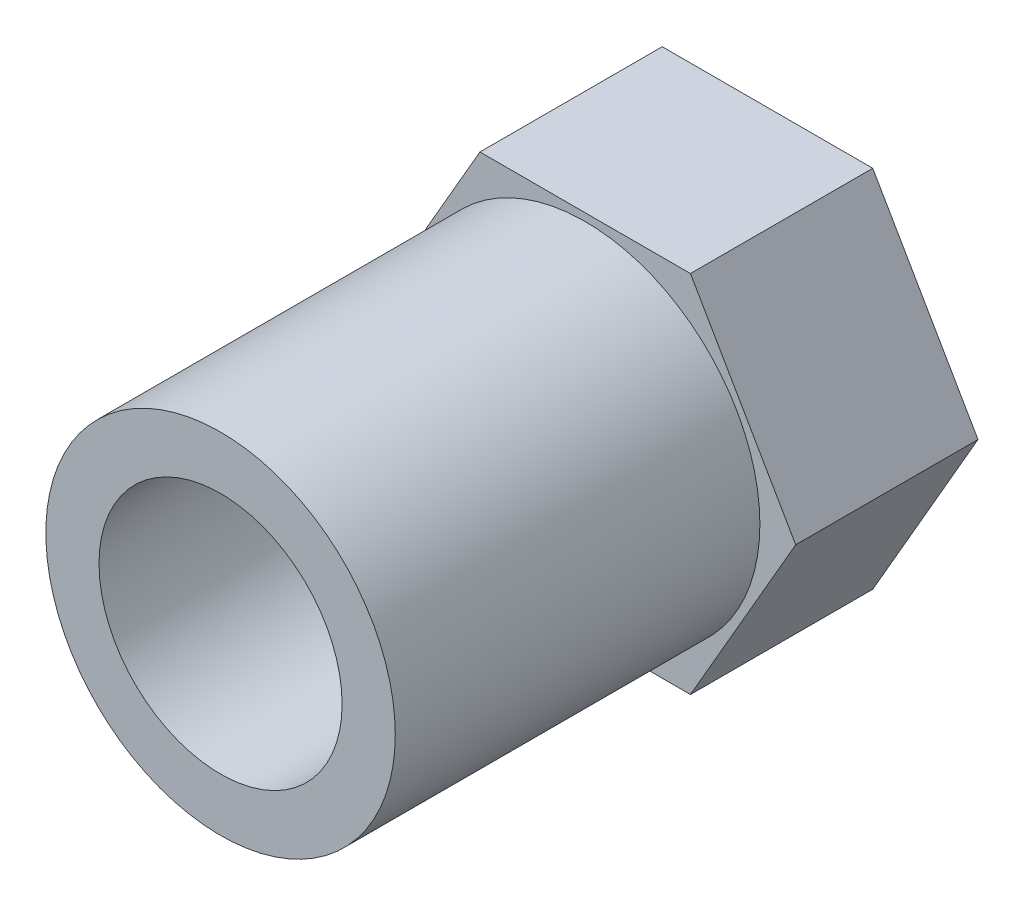
ISO-10303-21;
HEADER;
FILE_DESCRIPTION(('STEP AP214'),'2;1');
FILE_NAME('part.step','',(''),(''),'','','');
FILE_SCHEMA(('AUTOMOTIVE_DESIGN { 1 0 10303 214 1 1 1 1 }'));
ENDSEC;
DATA;
#1=APPLICATION_CONTEXT('core data for automotive mechanical design processes');
#2=APPLICATION_PROTOCOL_DEFINITION('international standard','automotive_design',2000,#1);
#3=PRODUCT_CONTEXT('',#1,'mechanical');
#4=PRODUCT('Part','Part','',(#3));
#5=PRODUCT_RELATED_PRODUCT_CATEGORY('part','',(#4));
#6=PRODUCT_DEFINITION_FORMATION('','',#4);
#7=PRODUCT_DEFINITION_CONTEXT('part definition',#1,'design');
#8=PRODUCT_DEFINITION('design','',#6,#7);
#9=PRODUCT_DEFINITION_SHAPE('','',#8);
#10=(LENGTH_UNIT() NAMED_UNIT(*) SI_UNIT(.MILLI.,.METRE.));
#11=(NAMED_UNIT(*) PLANE_ANGLE_UNIT() SI_UNIT($,.RADIAN.));
#12=(NAMED_UNIT(*) SI_UNIT($,.STERADIAN.) SOLID_ANGLE_UNIT());
#13=UNCERTAINTY_MEASURE_WITH_UNIT(LENGTH_MEASURE(1.E-05),#10,'distance_accuracy_value','');
#14=(GEOMETRIC_REPRESENTATION_CONTEXT(3) GLOBAL_UNCERTAINTY_ASSIGNED_CONTEXT((#13)) GLOBAL_UNIT_ASSIGNED_CONTEXT((#10,
#11,#12)) REPRESENTATION_CONTEXT('',''));
#15=CARTESIAN_POINT('',(0.,0.,0.));
#16=DIRECTION('',(0.,0.,1.));
#17=DIRECTION('',(1.,0.,0.));
#18=AXIS2_PLACEMENT_3D('',#15,#16,#17);
#19=CARTESIAN_POINT('',(0.,0.,12.));
#20=DIRECTION('',(0.,0.,1.));
#21=DIRECTION('',(1.,0.,0.));
#22=AXIS2_PLACEMENT_3D('',#19,#20,#21);
#23=PLANE('',#22);
#24=CARTESIAN_POINT('',(0.,0.,12.));
#25=DIRECTION('',(0.,0.,1.));
#26=DIRECTION('',(1.,0.,0.));
#27=AXIS2_PLACEMENT_3D('',#24,#25,#26);
#28=CIRCLE('',#27,5.75);
#29=CARTESIAN_POINT('',(5.75,0.,12.));
#30=VERTEX_POINT('',#29);
#31=EDGE_CURVE('E11',#30,#30,#28,.T.);
#32=ORIENTED_EDGE('',*,*,#31,.T.);
#33=EDGE_LOOP('',(#32));
#34=FACE_BOUND('',#33,.T.);
#35=CARTESIAN_POINT('',(0.,0.,12.));
#36=DIRECTION('',(0.,0.,1.));
#37=DIRECTION('',(1.,0.,0.));
#38=AXIS2_PLACEMENT_3D('',#35,#36,#37);
#39=CIRCLE('',#38,4.);
#40=CARTESIAN_POINT('',(4.,0.,12.));
#41=VERTEX_POINT('',#40);
#42=EDGE_CURVE('E54',#41,#41,#39,.T.);
#43=ORIENTED_EDGE('',*,*,#42,.F.);
#44=EDGE_LOOP('',(#43));
#45=FACE_BOUND('',#44,.T.);
#46=ADVANCED_FACE('F43',(#34,#45),#23,.T.);
#47=CARTESIAN_POINT('',(0.,0.,12.));
#48=DIRECTION('',(0.,0.,-1.));
#49=DIRECTION('',(-1.,0.,0.));
#50=AXIS2_PLACEMENT_3D('',#47,#48,#49);
#51=CYLINDRICAL_SURFACE('',#50,5.75);
#52=ORIENTED_EDGE('',*,*,#31,.F.);
#53=EDGE_LOOP('',(#52));
#54=FACE_BOUND('',#53,.T.);
#55=CARTESIAN_POINT('',(0.,0.,0.));
#56=DIRECTION('',(0.,0.,1.));
#57=DIRECTION('',(1.,0.,0.));
#58=AXIS2_PLACEMENT_3D('',#55,#56,#57);
#59=CIRCLE('',#58,5.75);
#60=CARTESIAN_POINT('',(5.75,0.,0.));
#61=VERTEX_POINT('',#60);
#62=EDGE_CURVE('E47',#61,#61,#59,.T.);
#63=ORIENTED_EDGE('',*,*,#62,.T.);
#64=EDGE_LOOP('',(#63));
#65=FACE_BOUND('',#64,.T.);
#66=ADVANCED_FACE('F45',(#54,#65),#51,.T.);
#67=CARTESIAN_POINT('',(0.,0.,12.));
#68=DIRECTION('',(0.,0.,-1.));
#69=DIRECTION('',(-1.,0.,0.));
#70=AXIS2_PLACEMENT_3D('',#67,#68,#69);
#71=CYLINDRICAL_SURFACE('',#70,4.);
#72=ORIENTED_EDGE('',*,*,#42,.T.);
#73=EDGE_LOOP('',(#72));
#74=FACE_BOUND('',#73,.T.);
#75=CARTESIAN_POINT('',(0.,0.,0.));
#76=DIRECTION('',(0.,0.,1.));
#77=DIRECTION('',(1.,0.,0.));
#78=AXIS2_PLACEMENT_3D('',#75,#76,#77);
#79=CIRCLE('',#78,4.);
#80=CARTESIAN_POINT('',(4.,0.,0.));
#81=VERTEX_POINT('',#80);
#82=EDGE_CURVE('E170',#81,#81,#79,.T.);
#83=ORIENTED_EDGE('',*,*,#82,.F.);
#84=EDGE_LOOP('',(#83));
#85=FACE_BOUND('',#84,.T.);
#86=ADVANCED_FACE('F209',(#74,#85),#71,.F.);
#87=CARTESIAN_POINT('',(0.,0.,0.));
#88=DIRECTION('',(0.,0.,1.));
#89=DIRECTION('',(1.,0.,0.));
#90=AXIS2_PLACEMENT_3D('',#87,#88,#89);
#91=PLANE('',#90);
#92=CARTESIAN_POINT('',(0.,0.,0.));
#93=DIRECTION('',(0.,0.,1.));
#94=DIRECTION('',(1.,0.,0.));
#95=AXIS2_PLACEMENT_3D('',#92,#93,#94);
#96=CIRCLE('',#95,1.65);
#97=CARTESIAN_POINT('',(1.65,0.,0.));
#98=VERTEX_POINT('',#97);
#99=EDGE_CURVE('E139',#98,#98,#96,.T.);
#100=ORIENTED_EDGE('',*,*,#99,.F.);
#101=EDGE_LOOP('',(#100));
#102=FACE_BOUND('',#101,.T.);
#103=ORIENTED_EDGE('',*,*,#82,.T.);
#104=EDGE_LOOP('',(#103));
#105=FACE_BOUND('',#104,.T.);
#106=ADVANCED_FACE('F184',(#102,#105),#91,.T.);
#107=CARTESIAN_POINT('',(-5.19615242270663,3.,-6.));
#108=DIRECTION('',(0.866025403784439,-0.5,0.));
#109=DIRECTION('',(0.5,0.866025403784439,0.));
#110=AXIS2_PLACEMENT_3D('',#107,#108,#109);
#111=PLANE('',#110);
#112=DIRECTION('',(0.5,0.866025403784439,0.));
#113=VECTOR('',#112,1.);
#114=CARTESIAN_POINT('',(-5.19615242270663,3.,0.));
#115=LINE('',#114,#113);
#116=CARTESIAN_POINT('',(-6.92820323027551,0.,0.));
#117=VERTEX_POINT('',#116);
#118=CARTESIAN_POINT('',(-3.46410161513775,6.,0.));
#119=VERTEX_POINT('',#118);
#120=EDGE_CURVE('E134',#117,#119,#115,.T.);
#121=ORIENTED_EDGE('',*,*,#120,.T.);
#122=DIRECTION('',(0.,0.,1.));
#123=VECTOR('',#122,1.);
#124=CARTESIAN_POINT('',(-3.46410161513775,6.,-6.));
#125=LINE('',#124,#123);
#126=CARTESIAN_POINT('',(-3.46410161513775,6.,-6.));
#127=VERTEX_POINT('',#126);
#128=EDGE_CURVE('E153',#127,#119,#125,.T.);
#129=ORIENTED_EDGE('',*,*,#128,.F.);
#130=DIRECTION('',(0.5,0.866025403784439,0.));
#131=VECTOR('',#130,1.);
#132=CARTESIAN_POINT('',(-5.19615242270663,3.,-6.));
#133=LINE('',#132,#131);
#134=CARTESIAN_POINT('',(-6.92820323027551,0.,-6.));
#135=VERTEX_POINT('',#134);
#136=EDGE_CURVE('E152',#135,#127,#133,.T.);
#137=ORIENTED_EDGE('',*,*,#136,.F.);
#138=DIRECTION('',(0.,0.,1.));
#139=VECTOR('',#138,1.);
#140=CARTESIAN_POINT('',(-6.92820323027551,0.,-6.));
#141=LINE('',#140,#139);
#142=EDGE_CURVE('E133',#135,#117,#141,.T.);
#143=ORIENTED_EDGE('',*,*,#142,.T.);
#144=EDGE_LOOP('',(#121,#129,#137,#143));
#145=FACE_BOUND('',#144,.T.);
#146=ADVANCED_FACE('F189',(#145),#111,.F.);
#147=CARTESIAN_POINT('',(0.,6.,-6.));
#148=DIRECTION('',(0.,-1.,0.));
#149=DIRECTION('',(0.,0.,-1.));
#150=AXIS2_PLACEMENT_3D('',#147,#148,#149);
#151=PLANE('',#150);
#152=DIRECTION('',(1.,0.,0.));
#153=VECTOR('',#152,1.);
#154=CARTESIAN_POINT('',(0.,6.,0.));
#155=LINE('',#154,#153);
#156=CARTESIAN_POINT('',(3.46410161513775,6.,0.));
#157=VERTEX_POINT('',#156);
#158=EDGE_CURVE('E82',#119,#157,#155,.T.);
#159=ORIENTED_EDGE('',*,*,#158,.T.);
#160=DIRECTION('',(0.,0.,1.));
#161=VECTOR('',#160,1.);
#162=CARTESIAN_POINT('',(3.46410161513775,6.,-6.));
#163=LINE('',#162,#161);
#164=CARTESIAN_POINT('',(3.46410161513775,6.,-6.));
#165=VERTEX_POINT('',#164);
#166=EDGE_CURVE('E118',#165,#157,#163,.T.);
#167=ORIENTED_EDGE('',*,*,#166,.F.);
#168=DIRECTION('',(1.,0.,0.));
#169=VECTOR('',#168,1.);
#170=CARTESIAN_POINT('',(0.,6.,-6.));
#171=LINE('',#170,#169);
#172=EDGE_CURVE('E62',#127,#165,#171,.T.);
#173=ORIENTED_EDGE('',*,*,#172,.F.);
#174=ORIENTED_EDGE('',*,*,#128,.T.);
#175=EDGE_LOOP('',(#159,#167,#173,#174));
#176=FACE_BOUND('',#175,.T.);
#177=ADVANCED_FACE('F217',(#176),#151,.F.);
#178=CARTESIAN_POINT('',(5.19615242270663,3.,-6.));
#179=DIRECTION('',(-0.866025403784439,-0.5,0.));
#180=DIRECTION('',(0.5,-0.866025403784439,0.));
#181=AXIS2_PLACEMENT_3D('',#178,#179,#180);
#182=PLANE('',#181);
#183=DIRECTION('',(0.5,-0.866025403784439,0.));
#184=VECTOR('',#183,1.);
#185=CARTESIAN_POINT('',(5.19615242270663,3.,0.));
#186=LINE('',#185,#184);
#187=CARTESIAN_POINT('',(6.92820323027551,0.,0.));
#188=VERTEX_POINT('',#187);
#189=EDGE_CURVE('E114',#157,#188,#186,.T.);
#190=ORIENTED_EDGE('',*,*,#189,.T.);
#191=DIRECTION('',(0.,0.,1.));
#192=VECTOR('',#191,1.);
#193=CARTESIAN_POINT('',(6.92820323027551,0.,-6.));
#194=LINE('',#193,#192);
#195=CARTESIAN_POINT('',(6.92820323027551,0.,-6.));
#196=VERTEX_POINT('',#195);
#197=EDGE_CURVE('E112',#196,#188,#194,.T.);
#198=ORIENTED_EDGE('',*,*,#197,.F.);
#199=DIRECTION('',(0.5,-0.866025403784439,0.));
#200=VECTOR('',#199,1.);
#201=CARTESIAN_POINT('',(5.19615242270663,3.,-6.));
#202=LINE('',#201,#200);
#203=EDGE_CURVE('E102',#165,#196,#202,.T.);
#204=ORIENTED_EDGE('',*,*,#203,.F.);
#205=ORIENTED_EDGE('',*,*,#166,.T.);
#206=EDGE_LOOP('',(#190,#198,#204,#205));
#207=FACE_BOUND('',#206,.T.);
#208=ADVANCED_FACE('F113',(#207),#182,.F.);
#209=CARTESIAN_POINT('',(5.19615242270663,-3.,-6.));
#210=DIRECTION('',(-0.866025403784439,0.5,0.));
#211=DIRECTION('',(-0.5,-0.866025403784439,0.));
#212=AXIS2_PLACEMENT_3D('',#209,#210,#211);
#213=PLANE('',#212);
#214=DIRECTION('',(-0.5,-0.866025403784439,0.));
#215=VECTOR('',#214,1.);
#216=CARTESIAN_POINT('',(5.19615242270663,-3.,0.));
#217=LINE('',#216,#215);
#218=CARTESIAN_POINT('',(3.46410161513775,-6.,0.));
#219=VERTEX_POINT('',#218);
#220=EDGE_CURVE('E145',#188,#219,#217,.T.);
#221=ORIENTED_EDGE('',*,*,#220,.T.);
#222=DIRECTION('',(0.,0.,1.));
#223=VECTOR('',#222,1.);
#224=CARTESIAN_POINT('',(3.46410161513775,-6.,-6.));
#225=LINE('',#224,#223);
#226=CARTESIAN_POINT('',(3.46410161513775,-6.,-6.));
#227=VERTEX_POINT('',#226);
#228=EDGE_CURVE('E119',#227,#219,#225,.T.);
#229=ORIENTED_EDGE('',*,*,#228,.F.);
#230=DIRECTION('',(-0.5,-0.866025403784439,0.));
#231=VECTOR('',#230,1.);
#232=CARTESIAN_POINT('',(5.19615242270663,-3.,-6.));
#233=LINE('',#232,#231);
#234=EDGE_CURVE('E106',#196,#227,#233,.T.);
#235=ORIENTED_EDGE('',*,*,#234,.F.);
#236=ORIENTED_EDGE('',*,*,#197,.T.);
#237=EDGE_LOOP('',(#221,#229,#235,#236));
#238=FACE_BOUND('',#237,.T.);
#239=ADVANCED_FACE('F121',(#238),#213,.F.);
#240=CARTESIAN_POINT('',(0.,-6.,-6.));
#241=DIRECTION('',(0.,1.,0.));
#242=DIRECTION('',(0.,0.,1.));
#243=AXIS2_PLACEMENT_3D('',#240,#241,#242);
#244=PLANE('',#243);
#245=DIRECTION('',(-1.,0.,0.));
#246=VECTOR('',#245,1.);
#247=CARTESIAN_POINT('',(0.,-6.,0.));
#248=LINE('',#247,#246);
#249=CARTESIAN_POINT('',(-3.46410161513775,-6.,0.));
#250=VERTEX_POINT('',#249);
#251=EDGE_CURVE('E142',#219,#250,#248,.T.);
#252=ORIENTED_EDGE('',*,*,#251,.T.);
#253=DIRECTION('',(0.,0.,1.));
#254=VECTOR('',#253,1.);
#255=CARTESIAN_POINT('',(-3.46410161513775,-6.,-6.));
#256=LINE('',#255,#254);
#257=CARTESIAN_POINT('',(-3.46410161513775,-6.,-6.));
#258=VERTEX_POINT('',#257);
#259=EDGE_CURVE('E160',#258,#250,#256,.T.);
#260=ORIENTED_EDGE('',*,*,#259,.F.);
#261=DIRECTION('',(-1.,0.,0.));
#262=VECTOR('',#261,1.);
#263=CARTESIAN_POINT('',(0.,-6.,-6.));
#264=LINE('',#263,#262);
#265=EDGE_CURVE('E125',#227,#258,#264,.T.);
#266=ORIENTED_EDGE('',*,*,#265,.F.);
#267=ORIENTED_EDGE('',*,*,#228,.T.);
#268=EDGE_LOOP('',(#252,#260,#266,#267));
#269=FACE_BOUND('',#268,.T.);
#270=ADVANCED_FACE('F195',(#269),#244,.F.);
#271=CARTESIAN_POINT('',(-5.19615242270663,-3.,-6.));
#272=DIRECTION('',(0.866025403784439,0.5,0.));
#273=DIRECTION('',(-0.5,0.866025403784439,0.));
#274=AXIS2_PLACEMENT_3D('',#271,#272,#273);
#275=PLANE('',#274);
#276=DIRECTION('',(-0.5,0.866025403784439,0.));
#277=VECTOR('',#276,1.);
#278=CARTESIAN_POINT('',(-5.19615242270663,-3.,0.));
#279=LINE('',#278,#277);
#280=EDGE_CURVE('E138',#250,#117,#279,.T.);
#281=ORIENTED_EDGE('',*,*,#280,.T.);
#282=ORIENTED_EDGE('',*,*,#142,.F.);
#283=DIRECTION('',(-0.5,0.866025403784439,0.));
#284=VECTOR('',#283,1.);
#285=CARTESIAN_POINT('',(-5.19615242270663,-3.,-6.));
#286=LINE('',#285,#284);
#287=EDGE_CURVE('E94',#258,#135,#286,.T.);
#288=ORIENTED_EDGE('',*,*,#287,.F.);
#289=ORIENTED_EDGE('',*,*,#259,.T.);
#290=EDGE_LOOP('',(#281,#282,#288,#289));
#291=FACE_BOUND('',#290,.T.);
#292=ADVANCED_FACE('F192',(#291),#275,.F.);
#293=CARTESIAN_POINT('',(0.,0.,-6.));
#294=DIRECTION('',(0.,0.,1.));
#295=DIRECTION('',(1.,0.,0.));
#296=AXIS2_PLACEMENT_3D('',#293,#294,#295);
#297=PLANE('',#296);
#298=CARTESIAN_POINT('',(0.,0.,-6.));
#299=DIRECTION('',(0.,0.,-1.));
#300=DIRECTION('',(-1.,0.,0.));
#301=AXIS2_PLACEMENT_3D('',#298,#299,#300);
#302=CIRCLE('',#301,1.65);
#303=CARTESIAN_POINT('',(-1.65,0.,-6.));
#304=VERTEX_POINT('',#303);
#305=EDGE_CURVE('E335',#304,#304,#302,.T.);
#306=ORIENTED_EDGE('',*,*,#305,.F.);
#307=EDGE_LOOP('',(#306));
#308=FACE_BOUND('',#307,.T.);
#309=ORIENTED_EDGE('',*,*,#136,.T.);
#310=ORIENTED_EDGE('',*,*,#172,.T.);
#311=ORIENTED_EDGE('',*,*,#203,.T.);
#312=ORIENTED_EDGE('',*,*,#234,.T.);
#313=ORIENTED_EDGE('',*,*,#265,.T.);
#314=ORIENTED_EDGE('',*,*,#287,.T.);
#315=EDGE_LOOP('',(#309,#310,#311,#312,#313,#314));
#316=FACE_BOUND('',#315,.T.);
#317=ADVANCED_FACE('F104',(#308,#316),#297,.F.);
#318=ORIENTED_EDGE('',*,*,#62,.F.);
#319=EDGE_LOOP('',(#318));
#320=FACE_BOUND('',#319,.T.);
#321=ORIENTED_EDGE('',*,*,#120,.F.);
#322=ORIENTED_EDGE('',*,*,#280,.F.);
#323=ORIENTED_EDGE('',*,*,#251,.F.);
#324=ORIENTED_EDGE('',*,*,#220,.F.);
#325=ORIENTED_EDGE('',*,*,#189,.F.);
#326=ORIENTED_EDGE('',*,*,#158,.F.);
#327=EDGE_LOOP('',(#321,#322,#323,#324,#325,#326));
#328=FACE_BOUND('',#327,.T.);
#329=ADVANCED_FACE('F180',(#320,#328),#91,.T.);
#330=CARTESIAN_POINT('',(0.,0.,-6.));
#331=DIRECTION('',(0.,0.,-1.));
#332=DIRECTION('',(-1.,0.,0.));
#333=AXIS2_PLACEMENT_3D('',#330,#331,#332);
#334=CYLINDRICAL_SURFACE('',#333,1.65);
#335=ORIENTED_EDGE('',*,*,#99,.T.);
#336=EDGE_LOOP('',(#335));
#337=FACE_BOUND('',#336,.T.);
#338=ORIENTED_EDGE('',*,*,#305,.T.);
#339=EDGE_LOOP('',(#338));
#340=FACE_BOUND('',#339,.T.);
#341=ADVANCED_FACE('F182',(#337,#340),#334,.F.);
#342=CLOSED_SHELL('',(#46,#66,#86,#106,#146,#177,#208,#239,#270,#292,#317,#329,#341));
#343=MANIFOLD_SOLID_BREP('B2',#342);
#344=ADVANCED_BREP_SHAPE_REPRESENTATION('',(#18,#343),#14);
#345=SHAPE_DEFINITION_REPRESENTATION(#9,#344);
ENDSEC;
END-ISO-10303-21;
